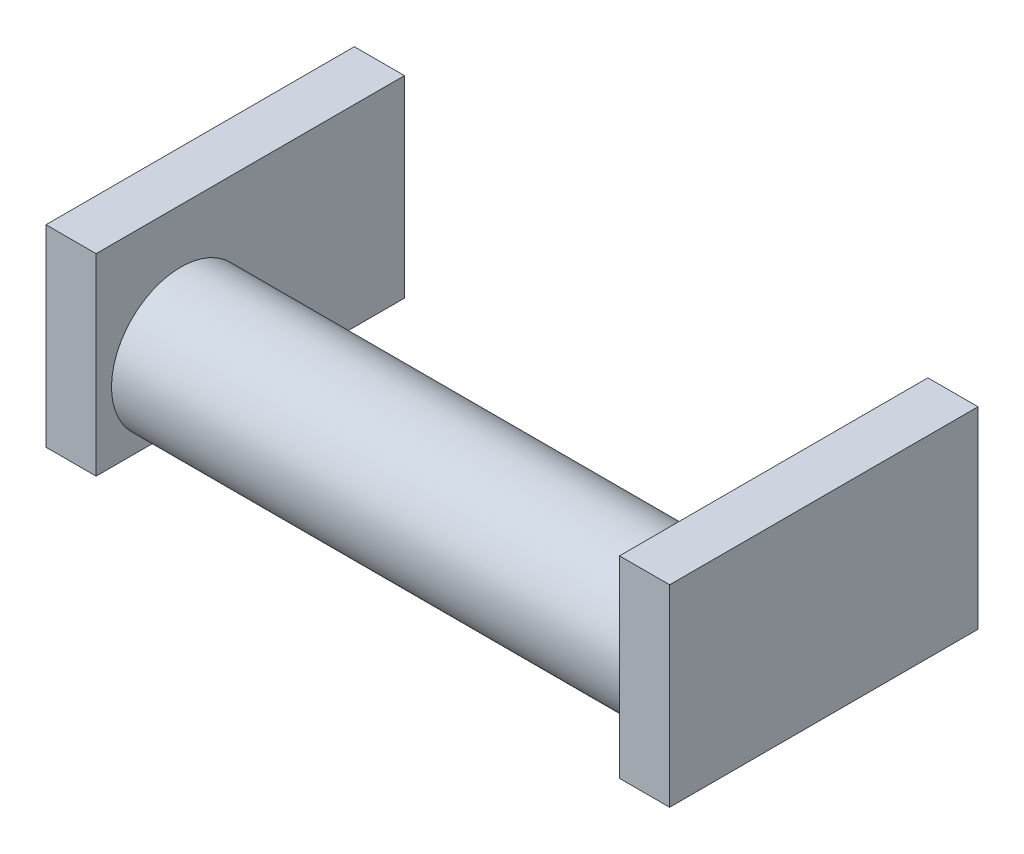
ISO-10303-21;
HEADER;
FILE_DESCRIPTION(('STEP AP214'),'2;1');
FILE_NAME('part.step','',(''),(''),'','','');
FILE_SCHEMA(('AUTOMOTIVE_DESIGN { 1 0 10303 214 1 1 1 1 }'));
ENDSEC;
DATA;
#1=APPLICATION_CONTEXT('core data for automotive mechanical design processes');
#2=APPLICATION_PROTOCOL_DEFINITION('international standard','automotive_design',2000,#1);
#3=PRODUCT_CONTEXT('',#1,'mechanical');
#4=PRODUCT('Part','Part','',(#3));
#5=PRODUCT_RELATED_PRODUCT_CATEGORY('part','',(#4));
#6=PRODUCT_DEFINITION_FORMATION('','',#4);
#7=PRODUCT_DEFINITION_CONTEXT('part definition',#1,'design');
#8=PRODUCT_DEFINITION('design','',#6,#7);
#9=PRODUCT_DEFINITION_SHAPE('','',#8);
#10=(LENGTH_UNIT() NAMED_UNIT(*) SI_UNIT(.MILLI.,.METRE.));
#11=(NAMED_UNIT(*) PLANE_ANGLE_UNIT() SI_UNIT($,.RADIAN.));
#12=(NAMED_UNIT(*) SI_UNIT($,.STERADIAN.) SOLID_ANGLE_UNIT());
#13=UNCERTAINTY_MEASURE_WITH_UNIT(LENGTH_MEASURE(1.E-05),#10,'distance_accuracy_value','');
#14=(GEOMETRIC_REPRESENTATION_CONTEXT(3) GLOBAL_UNCERTAINTY_ASSIGNED_CONTEXT((#13)) GLOBAL_UNIT_ASSIGNED_CONTEXT((#10,
#11,#12)) REPRESENTATION_CONTEXT('',''));
#15=CARTESIAN_POINT('',(0.,0.,0.));
#16=DIRECTION('',(0.,0.,1.));
#17=DIRECTION('',(1.,0.,0.));
#18=AXIS2_PLACEMENT_3D('',#15,#16,#17);
#19=CARTESIAN_POINT('',(-33.7,-50.4000000000179,40.));
#20=DIRECTION('',(-1.,0.,0.));
#21=DIRECTION('',(0.,0.,1.));
#22=AXIS2_PLACEMENT_3D('',#19,#20,#21);
#23=PLANE('',#22);
#24=DIRECTION('',(0.,0.,-1.));
#25=VECTOR('',#24,1.);
#26=CARTESIAN_POINT('',(-33.7,-75.4000000000179,40.));
#27=LINE('',#26,#25);
#28=CARTESIAN_POINT('',(-33.7,-75.4000000000179,40.));
#29=VERTEX_POINT('',#28);
#30=CARTESIAN_POINT('',(-33.7,-75.4000000000179,28.9999999999999));
#31=VERTEX_POINT('',#30);
#32=EDGE_CURVE('E189',#29,#31,#27,.T.);
#33=ORIENTED_EDGE('',*,*,#32,.T.);
#34=CARTESIAN_POINT('',(-33.7,-66.4000000000179,28.9999999999999));
#35=DIRECTION('',(1.,0.,0.));
#36=DIRECTION('',(0.,0.,-1.));
#37=AXIS2_PLACEMENT_3D('',#34,#35,#36);
#38=CIRCLE('',#37,9.00000000000003);
#39=EDGE_CURVE('E121',#31,#31,#38,.T.);
#40=ORIENTED_EDGE('',*,*,#39,.F.);
#41=CARTESIAN_POINT('',(-33.7,-75.4000000000179,0.));
#42=VERTEX_POINT('',#41);
#43=EDGE_CURVE('E80',#31,#42,#27,.T.);
#44=ORIENTED_EDGE('',*,*,#43,.T.);
#45=DIRECTION('',(0.,1.,0.));
#46=VECTOR('',#45,1.);
#47=CARTESIAN_POINT('',(-33.7,-50.4000000000179,0.));
#48=LINE('',#47,#46);
#49=CARTESIAN_POINT('',(-33.7,-50.4000000000179,0.));
#50=VERTEX_POINT('',#49);
#51=EDGE_CURVE('E167',#42,#50,#48,.T.);
#52=ORIENTED_EDGE('',*,*,#51,.T.);
#53=DIRECTION('',(0.,0.,-1.));
#54=VECTOR('',#53,1.);
#55=CARTESIAN_POINT('',(-33.7,-50.4000000000179,40.));
#56=LINE('',#55,#54);
#57=CARTESIAN_POINT('',(-33.7,-50.4000000000179,40.));
#58=VERTEX_POINT('',#57);
#59=EDGE_CURVE('E11',#58,#50,#56,.T.);
#60=ORIENTED_EDGE('',*,*,#59,.F.);
#61=DIRECTION('',(0.,1.,0.));
#62=VECTOR('',#61,1.);
#63=CARTESIAN_POINT('',(-33.7,-50.4000000000179,40.));
#64=LINE('',#63,#62);
#65=EDGE_CURVE('E176',#29,#58,#64,.T.);
#66=ORIENTED_EDGE('',*,*,#65,.F.);
#67=EDGE_LOOP('',(#33,#40,#44,#52,#60,#66));
#68=FACE_BOUND('',#67,.T.);
#69=ADVANCED_FACE('F35',(#68),#23,.F.);
#70=CARTESIAN_POINT('',(-33.7,-50.4000000000179,40.));
#71=DIRECTION('',(0.,-1.,0.));
#72=DIRECTION('',(0.,0.,-1.));
#73=AXIS2_PLACEMENT_3D('',#70,#71,#72);
#74=PLANE('',#73);
#75=DIRECTION('',(-1.,0.,0.));
#76=VECTOR('',#75,1.);
#77=CARTESIAN_POINT('',(-33.7,-50.4000000000179,0.));
#78=LINE('',#77,#76);
#79=CARTESIAN_POINT('',(-40.2,-50.4000000000179,0.));
#80=VERTEX_POINT('',#79);
#81=EDGE_CURVE('E184',#50,#80,#78,.T.);
#82=ORIENTED_EDGE('',*,*,#81,.T.);
#83=DIRECTION('',(0.,0.,-1.));
#84=VECTOR('',#83,1.);
#85=CARTESIAN_POINT('',(-40.2,-50.4000000000179,40.));
#86=LINE('',#85,#84);
#87=CARTESIAN_POINT('',(-40.2,-50.4000000000179,40.));
#88=VERTEX_POINT('',#87);
#89=EDGE_CURVE('E42',#88,#80,#86,.T.);
#90=ORIENTED_EDGE('',*,*,#89,.F.);
#91=DIRECTION('',(-1.,0.,0.));
#92=VECTOR('',#91,1.);
#93=CARTESIAN_POINT('',(-33.7,-50.4000000000179,40.));
#94=LINE('',#93,#92);
#95=EDGE_CURVE('E87',#58,#88,#94,.T.);
#96=ORIENTED_EDGE('',*,*,#95,.F.);
#97=ORIENTED_EDGE('',*,*,#59,.T.);
#98=EDGE_LOOP('',(#82,#90,#96,#97));
#99=FACE_BOUND('',#98,.T.);
#100=ADVANCED_FACE('F221',(#99),#74,.F.);
#101=CARTESIAN_POINT('',(-40.2,-50.4000000000179,40.));
#102=DIRECTION('',(1.,0.,0.));
#103=DIRECTION('',(0.,1.,0.));
#104=AXIS2_PLACEMENT_3D('',#101,#102,#103);
#105=PLANE('',#104);
#106=DIRECTION('',(0.,-1.,0.));
#107=VECTOR('',#106,1.);
#108=CARTESIAN_POINT('',(-40.2,-50.4000000000179,0.));
#109=LINE('',#108,#107);
#110=CARTESIAN_POINT('',(-40.2,-75.4000000000179,0.));
#111=VERTEX_POINT('',#110);
#112=EDGE_CURVE('E186',#80,#111,#109,.T.);
#113=ORIENTED_EDGE('',*,*,#112,.T.);
#114=DIRECTION('',(0.,0.,-1.));
#115=VECTOR('',#114,1.);
#116=CARTESIAN_POINT('',(-40.2,-75.4000000000179,40.));
#117=LINE('',#116,#115);
#118=CARTESIAN_POINT('',(-40.2,-75.4000000000179,40.));
#119=VERTEX_POINT('',#118);
#120=EDGE_CURVE('E191',#119,#111,#117,.T.);
#121=ORIENTED_EDGE('',*,*,#120,.F.);
#122=DIRECTION('',(0.,-1.,0.));
#123=VECTOR('',#122,1.);
#124=CARTESIAN_POINT('',(-40.2,-50.4000000000179,40.));
#125=LINE('',#124,#123);
#126=EDGE_CURVE('E180',#88,#119,#125,.T.);
#127=ORIENTED_EDGE('',*,*,#126,.F.);
#128=ORIENTED_EDGE('',*,*,#89,.T.);
#129=EDGE_LOOP('',(#113,#121,#127,#128));
#130=FACE_BOUND('',#129,.T.);
#131=ADVANCED_FACE('F197',(#130),#105,.F.);
#132=CARTESIAN_POINT('',(-33.7,-75.4000000000179,40.));
#133=DIRECTION('',(0.,1.,0.));
#134=DIRECTION('',(0.,0.,1.));
#135=AXIS2_PLACEMENT_3D('',#132,#133,#134);
#136=PLANE('',#135);
#137=DIRECTION('',(1.,0.,0.));
#138=VECTOR('',#137,1.);
#139=CARTESIAN_POINT('',(-33.7,-75.4000000000179,0.));
#140=LINE('',#139,#138);
#141=EDGE_CURVE('E178',#111,#42,#140,.T.);
#142=ORIENTED_EDGE('',*,*,#141,.T.);
#143=ORIENTED_EDGE('',*,*,#43,.F.);
#144=ORIENTED_EDGE('',*,*,#32,.F.);
#145=DIRECTION('',(1.,0.,0.));
#146=VECTOR('',#145,1.);
#147=CARTESIAN_POINT('',(-33.7,-75.4000000000179,40.));
#148=LINE('',#147,#146);
#149=EDGE_CURVE('E58',#119,#29,#148,.T.);
#150=ORIENTED_EDGE('',*,*,#149,.F.);
#151=ORIENTED_EDGE('',*,*,#120,.T.);
#152=EDGE_LOOP('',(#142,#143,#144,#150,#151));
#153=FACE_BOUND('',#152,.T.);
#154=ADVANCED_FACE('F204',(#153),#136,.F.);
#155=CARTESIAN_POINT('',(0.,0.,40.));
#156=DIRECTION('',(0.,0.,-1.));
#157=DIRECTION('',(-1.,0.,0.));
#158=AXIS2_PLACEMENT_3D('',#155,#156,#157);
#159=PLANE('',#158);
#160=ORIENTED_EDGE('',*,*,#65,.T.);
#161=ORIENTED_EDGE('',*,*,#95,.T.);
#162=ORIENTED_EDGE('',*,*,#126,.T.);
#163=ORIENTED_EDGE('',*,*,#149,.T.);
#164=EDGE_LOOP('',(#160,#161,#162,#163));
#165=FACE_BOUND('',#164,.T.);
#166=ADVANCED_FACE('F207',(#165),#159,.F.);
#167=CARTESIAN_POINT('',(0.,0.,0.));
#168=DIRECTION('',(0.,0.,-1.));
#169=DIRECTION('',(-1.,0.,0.));
#170=AXIS2_PLACEMENT_3D('',#167,#168,#169);
#171=PLANE('',#170);
#172=CARTESIAN_POINT('',(-37.2,-55.4000000000179,0.));
#173=DIRECTION('',(0.,0.,-1.));
#174=DIRECTION('',(-1.,0.,0.));
#175=AXIS2_PLACEMENT_3D('',#172,#173,#174);
#176=CIRCLE('',#175,1.25);
#177=CARTESIAN_POINT('',(-38.45,-55.4000000000179,0.));
#178=VERTEX_POINT('',#177);
#179=EDGE_CURVE('E168',#178,#178,#176,.T.);
#180=ORIENTED_EDGE('',*,*,#179,.F.);
#181=EDGE_LOOP('',(#180));
#182=FACE_BOUND('',#181,.T.);
#183=CARTESIAN_POINT('',(-37.2,-64.0000000000179,0.));
#184=DIRECTION('',(0.,0.,-1.));
#185=DIRECTION('',(-1.,0.,0.));
#186=AXIS2_PLACEMENT_3D('',#183,#184,#185);
#187=CIRCLE('',#186,1.25);
#188=CARTESIAN_POINT('',(-38.45,-64.0000000000179,0.));
#189=VERTEX_POINT('',#188);
#190=EDGE_CURVE('E163',#189,#189,#187,.T.);
#191=ORIENTED_EDGE('',*,*,#190,.F.);
#192=EDGE_LOOP('',(#191));
#193=FACE_BOUND('',#192,.T.);
#194=ORIENTED_EDGE('',*,*,#51,.F.);
#195=ORIENTED_EDGE('',*,*,#141,.F.);
#196=ORIENTED_EDGE('',*,*,#112,.F.);
#197=ORIENTED_EDGE('',*,*,#81,.F.);
#198=EDGE_LOOP('',(#194,#195,#196,#197));
#199=FACE_BOUND('',#198,.T.);
#200=ADVANCED_FACE('F202',(#182,#193,#199),#171,.T.);
#201=CARTESIAN_POINT('',(-37.2,-64.0000000000179,10.));
#202=DIRECTION('',(0.,0.,-1.));
#203=DIRECTION('',(-1.,0.,0.));
#204=AXIS2_PLACEMENT_3D('',#201,#202,#203);
#205=CYLINDRICAL_SURFACE('',#204,1.25);
#206=CARTESIAN_POINT('',(-37.2,-64.0000000000179,10.));
#207=DIRECTION('',(0.,0.,-1.));
#208=DIRECTION('',(-1.,0.,0.));
#209=AXIS2_PLACEMENT_3D('',#206,#207,#208);
#210=CIRCLE('',#209,1.25);
#211=CARTESIAN_POINT('',(-38.45,-64.0000000000179,10.));
#212=VERTEX_POINT('',#211);
#213=EDGE_CURVE('E171',#212,#212,#210,.T.);
#214=ORIENTED_EDGE('',*,*,#213,.F.);
#215=EDGE_LOOP('',(#214));
#216=FACE_BOUND('',#215,.T.);
#217=ORIENTED_EDGE('',*,*,#190,.T.);
#218=EDGE_LOOP('',(#217));
#219=FACE_BOUND('',#218,.T.);
#220=ADVANCED_FACE('F214',(#216,#219),#205,.F.);
#221=CARTESIAN_POINT('',(-37.2,-64.0000000000179,10.));
#222=DIRECTION('',(0.,0.,-1.));
#223=DIRECTION('',(-1.,0.,0.));
#224=AXIS2_PLACEMENT_3D('',#221,#222,#223);
#225=PLANE('',#224);
#226=ORIENTED_EDGE('',*,*,#213,.T.);
#227=EDGE_LOOP('',(#226));
#228=FACE_BOUND('',#227,.T.);
#229=ADVANCED_FACE('F354',(#228),#225,.T.);
#230=CARTESIAN_POINT('',(-37.2,-55.4000000000179,10.));
#231=DIRECTION('',(0.,0.,-1.));
#232=DIRECTION('',(-1.,0.,0.));
#233=AXIS2_PLACEMENT_3D('',#230,#231,#232);
#234=CYLINDRICAL_SURFACE('',#233,1.25);
#235=CARTESIAN_POINT('',(-37.2,-55.4000000000179,10.));
#236=DIRECTION('',(0.,0.,-1.));
#237=DIRECTION('',(-1.,0.,0.));
#238=AXIS2_PLACEMENT_3D('',#235,#236,#237);
#239=CIRCLE('',#238,1.25);
#240=CARTESIAN_POINT('',(-38.45,-55.4000000000179,10.));
#241=VERTEX_POINT('',#240);
#242=EDGE_CURVE('E164',#241,#241,#239,.T.);
#243=ORIENTED_EDGE('',*,*,#242,.F.);
#244=EDGE_LOOP('',(#243));
#245=FACE_BOUND('',#244,.T.);
#246=ORIENTED_EDGE('',*,*,#179,.T.);
#247=EDGE_LOOP('',(#246));
#248=FACE_BOUND('',#247,.T.);
#249=ADVANCED_FACE('F350',(#245,#248),#234,.F.);
#250=CARTESIAN_POINT('',(-37.2,-55.4000000000179,10.));
#251=DIRECTION('',(0.,0.,-1.));
#252=DIRECTION('',(-1.,0.,0.));
#253=AXIS2_PLACEMENT_3D('',#250,#251,#252);
#254=PLANE('',#253);
#255=ORIENTED_EDGE('',*,*,#242,.T.);
#256=EDGE_LOOP('',(#255));
#257=FACE_BOUND('',#256,.T.);
#258=ADVANCED_FACE('F246',(#257),#254,.T.);
#259=CARTESIAN_POINT('',(59.6558441227158,-66.4000000000179,28.9999999999999));
#260=DIRECTION('',(-1.,0.,0.));
#261=DIRECTION('',(0.,0.,1.));
#262=AXIS2_PLACEMENT_3D('',#259,#260,#261);
#263=CYLINDRICAL_SURFACE('',#262,9.00000000000003);
#264=CARTESIAN_POINT('',(34.2,-66.4000000000179,28.9999999999999));
#265=DIRECTION('',(-1.,0.,0.));
#266=DIRECTION('',(0.,0.,1.));
#267=AXIS2_PLACEMENT_3D('',#264,#265,#266);
#268=CIRCLE('',#267,9.00000000000003);
#269=CARTESIAN_POINT('',(34.2,-75.4000000000179,28.9999999999999));
#270=VERTEX_POINT('',#269);
#271=EDGE_CURVE('E120',#270,#270,#268,.T.);
#272=ORIENTED_EDGE('',*,*,#271,.T.);
#273=EDGE_LOOP('',(#272));
#274=FACE_BOUND('',#273,.T.);
#275=ORIENTED_EDGE('',*,*,#39,.T.);
#276=EDGE_LOOP('',(#275));
#277=FACE_BOUND('',#276,.T.);
#278=ADVANCED_FACE('F241',(#274,#277),#263,.T.);
#279=CARTESIAN_POINT('',(34.2,-50.4000000000179,40.));
#280=DIRECTION('',(-1.,0.,0.));
#281=DIRECTION('',(0.,0.,1.));
#282=AXIS2_PLACEMENT_3D('',#279,#280,#281);
#283=PLANE('',#282);
#284=DIRECTION('',(0.,0.,-1.));
#285=VECTOR('',#284,1.);
#286=CARTESIAN_POINT('',(34.2,-75.4000000000179,40.));
#287=LINE('',#286,#285);
#288=CARTESIAN_POINT('',(34.2,-75.4000000000179,0.));
#289=VERTEX_POINT('',#288);
#290=EDGE_CURVE('E122',#270,#289,#287,.T.);
#291=ORIENTED_EDGE('',*,*,#290,.F.);
#292=ORIENTED_EDGE('',*,*,#271,.F.);
#293=CARTESIAN_POINT('',(34.2,-75.4000000000179,40.));
#294=VERTEX_POINT('',#293);
#295=EDGE_CURVE('E49',#294,#270,#287,.T.);
#296=ORIENTED_EDGE('',*,*,#295,.F.);
#297=DIRECTION('',(0.,1.,0.));
#298=VECTOR('',#297,1.);
#299=CARTESIAN_POINT('',(34.2,-50.4000000000179,40.));
#300=LINE('',#299,#298);
#301=CARTESIAN_POINT('',(34.2,-50.4000000000179,40.));
#302=VERTEX_POINT('',#301);
#303=EDGE_CURVE('E117',#294,#302,#300,.T.);
#304=ORIENTED_EDGE('',*,*,#303,.T.);
#305=DIRECTION('',(0.,0.,-1.));
#306=VECTOR('',#305,1.);
#307=CARTESIAN_POINT('',(34.2,-50.4000000000179,40.));
#308=LINE('',#307,#306);
#309=CARTESIAN_POINT('',(34.2,-50.4000000000179,0.));
#310=VERTEX_POINT('',#309);
#311=EDGE_CURVE('E143',#302,#310,#308,.T.);
#312=ORIENTED_EDGE('',*,*,#311,.T.);
#313=DIRECTION('',(0.,1.,0.));
#314=VECTOR('',#313,1.);
#315=CARTESIAN_POINT('',(34.2,-50.4000000000179,0.));
#316=LINE('',#315,#314);
#317=EDGE_CURVE('E144',#289,#310,#316,.T.);
#318=ORIENTED_EDGE('',*,*,#317,.F.);
#319=EDGE_LOOP('',(#291,#292,#296,#304,#312,#318));
#320=FACE_BOUND('',#319,.T.);
#321=ADVANCED_FACE('F116',(#320),#283,.T.);
#322=CARTESIAN_POINT('',(34.2,-75.4000000000179,40.));
#323=DIRECTION('',(0.,-1.,0.));
#324=DIRECTION('',(0.,0.,-1.));
#325=AXIS2_PLACEMENT_3D('',#322,#323,#324);
#326=PLANE('',#325);
#327=DIRECTION('',(-1.,0.,0.));
#328=VECTOR('',#327,1.);
#329=CARTESIAN_POINT('',(34.2,-75.4000000000179,0.));
#330=LINE('',#329,#328);
#331=CARTESIAN_POINT('',(40.7,-75.4000000000179,0.));
#332=VERTEX_POINT('',#331);
#333=EDGE_CURVE('E147',#332,#289,#330,.T.);
#334=ORIENTED_EDGE('',*,*,#333,.F.);
#335=DIRECTION('',(0.,0.,-1.));
#336=VECTOR('',#335,1.);
#337=CARTESIAN_POINT('',(40.7,-75.4000000000179,40.));
#338=LINE('',#337,#336);
#339=CARTESIAN_POINT('',(40.7,-75.4000000000179,40.));
#340=VERTEX_POINT('',#339);
#341=EDGE_CURVE('E136',#340,#332,#338,.T.);
#342=ORIENTED_EDGE('',*,*,#341,.F.);
#343=DIRECTION('',(-1.,0.,0.));
#344=VECTOR('',#343,1.);
#345=CARTESIAN_POINT('',(34.2,-75.4000000000179,40.));
#346=LINE('',#345,#344);
#347=EDGE_CURVE('E128',#340,#294,#346,.T.);
#348=ORIENTED_EDGE('',*,*,#347,.T.);
#349=ORIENTED_EDGE('',*,*,#295,.T.);
#350=ORIENTED_EDGE('',*,*,#290,.T.);
#351=EDGE_LOOP('',(#334,#342,#348,#349,#350));
#352=FACE_BOUND('',#351,.T.);
#353=ADVANCED_FACE('F135',(#352),#326,.T.);
#354=CARTESIAN_POINT('',(40.7,-50.4000000000179,40.));
#355=DIRECTION('',(1.,0.,0.));
#356=DIRECTION('',(0.,1.,0.));
#357=AXIS2_PLACEMENT_3D('',#354,#355,#356);
#358=PLANE('',#357);
#359=DIRECTION('',(0.,-1.,0.));
#360=VECTOR('',#359,1.);
#361=CARTESIAN_POINT('',(40.7,-50.4000000000179,0.));
#362=LINE('',#361,#360);
#363=CARTESIAN_POINT('',(40.7,-50.4000000000179,0.));
#364=VERTEX_POINT('',#363);
#365=EDGE_CURVE('E151',#364,#332,#362,.T.);
#366=ORIENTED_EDGE('',*,*,#365,.F.);
#367=DIRECTION('',(0.,0.,-1.));
#368=VECTOR('',#367,1.);
#369=CARTESIAN_POINT('',(40.7,-50.4000000000179,40.));
#370=LINE('',#369,#368);
#371=CARTESIAN_POINT('',(40.7,-50.4000000000179,40.));
#372=VERTEX_POINT('',#371);
#373=EDGE_CURVE('E157',#372,#364,#370,.T.);
#374=ORIENTED_EDGE('',*,*,#373,.F.);
#375=DIRECTION('',(0.,-1.,0.));
#376=VECTOR('',#375,1.);
#377=CARTESIAN_POINT('',(40.7,-50.4000000000179,40.));
#378=LINE('',#377,#376);
#379=EDGE_CURVE('E137',#372,#340,#378,.T.);
#380=ORIENTED_EDGE('',*,*,#379,.T.);
#381=ORIENTED_EDGE('',*,*,#341,.T.);
#382=EDGE_LOOP('',(#366,#374,#380,#381));
#383=FACE_BOUND('',#382,.T.);
#384=ADVANCED_FACE('F266',(#383),#358,.T.);
#385=CARTESIAN_POINT('',(34.2,-50.4000000000179,40.));
#386=DIRECTION('',(0.,1.,0.));
#387=DIRECTION('',(0.,0.,1.));
#388=AXIS2_PLACEMENT_3D('',#385,#386,#387);
#389=PLANE('',#388);
#390=DIRECTION('',(1.,0.,0.));
#391=VECTOR('',#390,1.);
#392=CARTESIAN_POINT('',(34.2,-50.4000000000179,0.));
#393=LINE('',#392,#391);
#394=EDGE_CURVE('E132',#310,#364,#393,.T.);
#395=ORIENTED_EDGE('',*,*,#394,.F.);
#396=ORIENTED_EDGE('',*,*,#311,.F.);
#397=DIRECTION('',(1.,0.,0.));
#398=VECTOR('',#397,1.);
#399=CARTESIAN_POINT('',(34.2,-50.4000000000179,40.));
#400=LINE('',#399,#398);
#401=EDGE_CURVE('E131',#302,#372,#400,.T.);
#402=ORIENTED_EDGE('',*,*,#401,.T.);
#403=ORIENTED_EDGE('',*,*,#373,.T.);
#404=EDGE_LOOP('',(#395,#396,#402,#403));
#405=FACE_BOUND('',#404,.T.);
#406=ADVANCED_FACE('F275',(#405),#389,.T.);
#407=CARTESIAN_POINT('',(0.499999999999957,0.,40.));
#408=DIRECTION('',(0.,0.,-1.));
#409=DIRECTION('',(1.,0.,0.));
#410=AXIS2_PLACEMENT_3D('',#407,#408,#409);
#411=PLANE('',#410);
#412=ORIENTED_EDGE('',*,*,#303,.F.);
#413=ORIENTED_EDGE('',*,*,#347,.F.);
#414=ORIENTED_EDGE('',*,*,#379,.F.);
#415=ORIENTED_EDGE('',*,*,#401,.F.);
#416=EDGE_LOOP('',(#412,#413,#414,#415));
#417=FACE_BOUND('',#416,.T.);
#418=ADVANCED_FACE('F126',(#417),#411,.F.);
#419=CARTESIAN_POINT('',(0.499999999999953,0.,0.));
#420=DIRECTION('',(0.,0.,-1.));
#421=DIRECTION('',(1.,0.,0.));
#422=AXIS2_PLACEMENT_3D('',#419,#420,#421);
#423=PLANE('',#422);
#424=CARTESIAN_POINT('',(37.7,-55.4000000000179,0.));
#425=DIRECTION('',(0.,0.,1.));
#426=DIRECTION('',(1.,0.,0.));
#427=AXIS2_PLACEMENT_3D('',#424,#425,#426);
#428=CIRCLE('',#427,1.25);
#429=CARTESIAN_POINT('',(38.95,-55.4000000000179,0.));
#430=VERTEX_POINT('',#429);
#431=EDGE_CURVE('E399',#430,#430,#428,.T.);
#432=ORIENTED_EDGE('',*,*,#431,.T.);
#433=EDGE_LOOP('',(#432));
#434=FACE_BOUND('',#433,.T.);
#435=CARTESIAN_POINT('',(37.7,-64.0000000000179,0.));
#436=DIRECTION('',(0.,0.,1.));
#437=DIRECTION('',(1.,0.,0.));
#438=AXIS2_PLACEMENT_3D('',#435,#436,#437);
#439=CIRCLE('',#438,1.25);
#440=CARTESIAN_POINT('',(38.95,-64.0000000000179,0.));
#441=VERTEX_POINT('',#440);
#442=EDGE_CURVE('E406',#441,#441,#439,.T.);
#443=ORIENTED_EDGE('',*,*,#442,.T.);
#444=EDGE_LOOP('',(#443));
#445=FACE_BOUND('',#444,.T.);
#446=ORIENTED_EDGE('',*,*,#317,.T.);
#447=ORIENTED_EDGE('',*,*,#394,.T.);
#448=ORIENTED_EDGE('',*,*,#365,.T.);
#449=ORIENTED_EDGE('',*,*,#333,.T.);
#450=EDGE_LOOP('',(#446,#447,#448,#449));
#451=FACE_BOUND('',#450,.T.);
#452=ADVANCED_FACE('F294',(#434,#445,#451),#423,.T.);
#453=CARTESIAN_POINT('',(37.7,-64.0000000000179,10.));
#454=DIRECTION('',(0.,0.,-1.));
#455=DIRECTION('',(-1.,0.,0.));
#456=AXIS2_PLACEMENT_3D('',#453,#454,#455);
#457=CYLINDRICAL_SURFACE('',#456,1.25);
#458=CARTESIAN_POINT('',(37.7,-64.0000000000179,10.));
#459=DIRECTION('',(0.,0.,1.));
#460=DIRECTION('',(1.,0.,0.));
#461=AXIS2_PLACEMENT_3D('',#458,#459,#460);
#462=CIRCLE('',#461,1.25);
#463=CARTESIAN_POINT('',(38.95,-64.0000000000179,10.));
#464=VERTEX_POINT('',#463);
#465=EDGE_CURVE('E402',#464,#464,#462,.T.);
#466=ORIENTED_EDGE('',*,*,#465,.T.);
#467=EDGE_LOOP('',(#466));
#468=FACE_BOUND('',#467,.T.);
#469=ORIENTED_EDGE('',*,*,#442,.F.);
#470=EDGE_LOOP('',(#469));
#471=FACE_BOUND('',#470,.T.);
#472=ADVANCED_FACE('F303',(#468,#471),#457,.F.);
#473=CARTESIAN_POINT('',(37.7,-64.0000000000179,10.));
#474=DIRECTION('',(0.,0.,-1.));
#475=DIRECTION('',(1.,0.,0.));
#476=AXIS2_PLACEMENT_3D('',#473,#474,#475);
#477=PLANE('',#476);
#478=ORIENTED_EDGE('',*,*,#465,.F.);
#479=EDGE_LOOP('',(#478));
#480=FACE_BOUND('',#479,.T.);
#481=ADVANCED_FACE('F313',(#480),#477,.T.);
#482=CARTESIAN_POINT('',(37.7,-55.4000000000179,10.));
#483=DIRECTION('',(0.,0.,-1.));
#484=DIRECTION('',(-1.,0.,0.));
#485=AXIS2_PLACEMENT_3D('',#482,#483,#484);
#486=CYLINDRICAL_SURFACE('',#485,1.25);
#487=CARTESIAN_POINT('',(37.7,-55.4000000000179,10.));
#488=DIRECTION('',(0.,0.,1.));
#489=DIRECTION('',(1.,0.,0.));
#490=AXIS2_PLACEMENT_3D('',#487,#488,#489);
#491=CIRCLE('',#490,1.25);
#492=CARTESIAN_POINT('',(38.95,-55.4000000000179,10.));
#493=VERTEX_POINT('',#492);
#494=EDGE_CURVE('E148',#493,#493,#491,.T.);
#495=ORIENTED_EDGE('',*,*,#494,.T.);
#496=EDGE_LOOP('',(#495));
#497=FACE_BOUND('',#496,.T.);
#498=ORIENTED_EDGE('',*,*,#431,.F.);
#499=EDGE_LOOP('',(#498));
#500=FACE_BOUND('',#499,.T.);
#501=ADVANCED_FACE('F323',(#497,#500),#486,.F.);
#502=CARTESIAN_POINT('',(37.7,-55.4000000000179,10.));
#503=DIRECTION('',(0.,0.,-1.));
#504=DIRECTION('',(1.,0.,0.));
#505=AXIS2_PLACEMENT_3D('',#502,#503,#504);
#506=PLANE('',#505);
#507=ORIENTED_EDGE('',*,*,#494,.F.);
#508=EDGE_LOOP('',(#507));
#509=FACE_BOUND('',#508,.T.);
#510=ADVANCED_FACE('F333',(#509),#506,.T.);
#511=CLOSED_SHELL('',(#69,#100,#131,#154,#166,#200,#220,#229,#249,#258,#278,#321,#353,#384,#406,
#418,#452,#472,#481,#501,#510));
#512=MANIFOLD_SOLID_BREP('B2',#511);
#513=ADVANCED_BREP_SHAPE_REPRESENTATION('',(#18,#512),#14);
#514=SHAPE_DEFINITION_REPRESENTATION(#9,#513);
ENDSEC;
END-ISO-10303-21;
